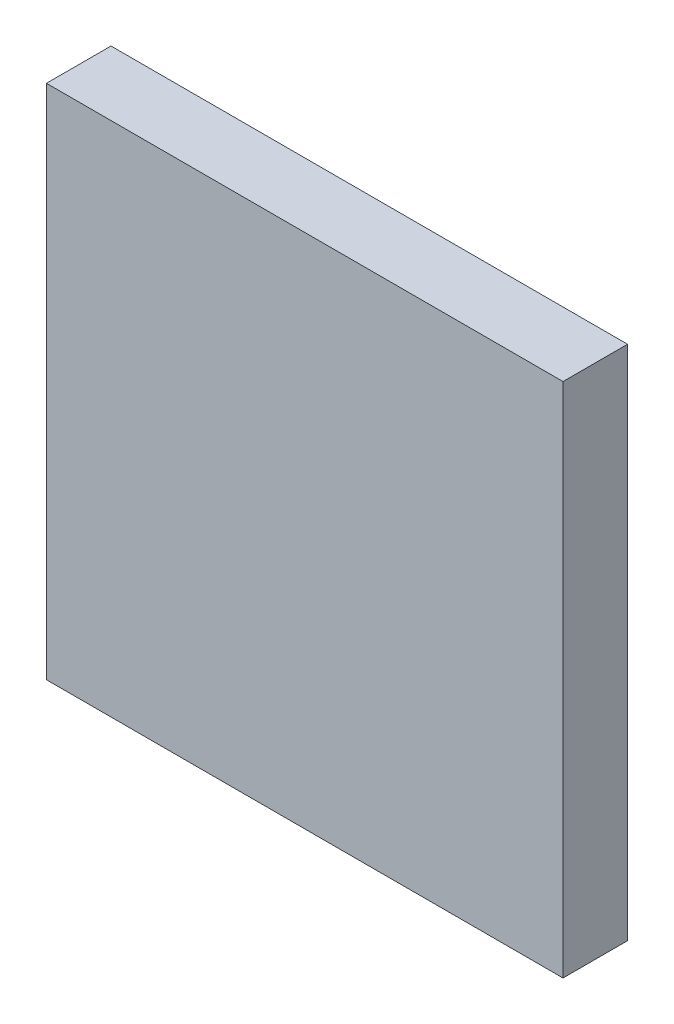
ISO-10303-21;
HEADER;
FILE_DESCRIPTION(('STEP AP214'),'2;1');
FILE_NAME('part.step','',(''),(''),'','','');
FILE_SCHEMA(('AUTOMOTIVE_DESIGN { 1 0 10303 214 1 1 1 1 }'));
ENDSEC;
DATA;
#1=APPLICATION_CONTEXT('core data for automotive mechanical design processes');
#2=APPLICATION_PROTOCOL_DEFINITION('international standard','automotive_design',2000,#1);
#3=PRODUCT_CONTEXT('',#1,'mechanical');
#4=PRODUCT('Part','Part','',(#3));
#5=PRODUCT_RELATED_PRODUCT_CATEGORY('part','',(#4));
#6=PRODUCT_DEFINITION_FORMATION('','',#4);
#7=PRODUCT_DEFINITION_CONTEXT('part definition',#1,'design');
#8=PRODUCT_DEFINITION('design','',#6,#7);
#9=PRODUCT_DEFINITION_SHAPE('','',#8);
#10=(LENGTH_UNIT() NAMED_UNIT(*) SI_UNIT(.MILLI.,.METRE.));
#11=(NAMED_UNIT(*) PLANE_ANGLE_UNIT() SI_UNIT($,.RADIAN.));
#12=(NAMED_UNIT(*) SI_UNIT($,.STERADIAN.) SOLID_ANGLE_UNIT());
#13=UNCERTAINTY_MEASURE_WITH_UNIT(LENGTH_MEASURE(1.E-05),#10,'distance_accuracy_value','');
#14=(GEOMETRIC_REPRESENTATION_CONTEXT(3) GLOBAL_UNCERTAINTY_ASSIGNED_CONTEXT((#13)) GLOBAL_UNIT_ASSIGNED_CONTEXT((#10,
#11,#12)) REPRESENTATION_CONTEXT('',''));
#15=CARTESIAN_POINT('',(0.,0.,0.));
#16=DIRECTION('',(0.,0.,1.));
#17=DIRECTION('',(1.,0.,0.));
#18=AXIS2_PLACEMENT_3D('',#15,#16,#17);
#19=CARTESIAN_POINT('',(0.,0.,3.175));
#20=DIRECTION('',(-1.,0.,0.));
#21=DIRECTION('',(0.,0.,1.));
#22=AXIS2_PLACEMENT_3D('',#19,#20,#21);
#23=PLANE('',#22);
#24=DIRECTION('',(0.,1.,0.));
#25=VECTOR('',#24,1.);
#26=CARTESIAN_POINT('',(0.,0.,0.));
#27=LINE('',#26,#25);
#28=CARTESIAN_POINT('',(0.,0.,0.));
#29=VERTEX_POINT('',#28);
#30=CARTESIAN_POINT('',(0.,25.4,0.));
#31=VERTEX_POINT('',#30);
#32=EDGE_CURVE('E107',#29,#31,#27,.T.);
#33=ORIENTED_EDGE('',*,*,#32,.T.);
#34=DIRECTION('',(0.,0.,-1.));
#35=VECTOR('',#34,1.);
#36=CARTESIAN_POINT('',(0.,25.4,3.175));
#37=LINE('',#36,#35);
#38=CARTESIAN_POINT('',(0.,25.4,3.175));
#39=VERTEX_POINT('',#38);
#40=EDGE_CURVE('E11',#39,#31,#37,.T.);
#41=ORIENTED_EDGE('',*,*,#40,.F.);
#42=DIRECTION('',(0.,1.,0.));
#43=VECTOR('',#42,1.);
#44=CARTESIAN_POINT('',(0.,0.,3.175));
#45=LINE('',#44,#43);
#46=CARTESIAN_POINT('',(0.,0.,3.175));
#47=VERTEX_POINT('',#46);
#48=EDGE_CURVE('E91',#47,#39,#45,.T.);
#49=ORIENTED_EDGE('',*,*,#48,.F.);
#50=DIRECTION('',(0.,0.,-1.));
#51=VECTOR('',#50,1.);
#52=CARTESIAN_POINT('',(0.,0.,3.175));
#53=LINE('',#52,#51);
#54=EDGE_CURVE('E103',#47,#29,#53,.T.);
#55=ORIENTED_EDGE('',*,*,#54,.T.);
#56=EDGE_LOOP('',(#33,#41,#49,#55));
#57=FACE_BOUND('',#56,.T.);
#58=ADVANCED_FACE('F39',(#57),#23,.F.);
#59=CARTESIAN_POINT('',(0.,25.4,3.175));
#60=DIRECTION('',(0.,-1.,0.));
#61=DIRECTION('',(0.,0.,-1.));
#62=AXIS2_PLACEMENT_3D('',#59,#60,#61);
#63=PLANE('',#62);
#64=DIRECTION('',(-1.,0.,0.));
#65=VECTOR('',#64,1.);
#66=CARTESIAN_POINT('',(0.,25.4,0.));
#67=LINE('',#66,#65);
#68=CARTESIAN_POINT('',(-25.4,25.4,0.));
#69=VERTEX_POINT('',#68);
#70=EDGE_CURVE('E96',#31,#69,#67,.T.);
#71=ORIENTED_EDGE('',*,*,#70,.T.);
#72=DIRECTION('',(0.,0.,-1.));
#73=VECTOR('',#72,1.);
#74=CARTESIAN_POINT('',(-25.4,25.4,3.175));
#75=LINE('',#74,#73);
#76=CARTESIAN_POINT('',(-25.4,25.4,3.175));
#77=VERTEX_POINT('',#76);
#78=EDGE_CURVE('E48',#77,#69,#75,.T.);
#79=ORIENTED_EDGE('',*,*,#78,.F.);
#80=DIRECTION('',(-1.,0.,0.));
#81=VECTOR('',#80,1.);
#82=CARTESIAN_POINT('',(0.,25.4,3.175));
#83=LINE('',#82,#81);
#84=EDGE_CURVE('E86',#39,#77,#83,.T.);
#85=ORIENTED_EDGE('',*,*,#84,.F.);
#86=ORIENTED_EDGE('',*,*,#40,.T.);
#87=EDGE_LOOP('',(#71,#79,#85,#86));
#88=FACE_BOUND('',#87,.T.);
#89=ADVANCED_FACE('F95',(#88),#63,.F.);
#90=CARTESIAN_POINT('',(-25.4,0.,3.175));
#91=DIRECTION('',(1.,0.,0.));
#92=DIRECTION('',(0.,0.,-1.));
#93=AXIS2_PLACEMENT_3D('',#90,#91,#92);
#94=PLANE('',#93);
#95=DIRECTION('',(0.,-1.,0.));
#96=VECTOR('',#95,1.);
#97=CARTESIAN_POINT('',(-25.4,0.,0.));
#98=LINE('',#97,#96);
#99=CARTESIAN_POINT('',(-25.4,0.,0.));
#100=VERTEX_POINT('',#99);
#101=EDGE_CURVE('E73',#69,#100,#98,.T.);
#102=ORIENTED_EDGE('',*,*,#101,.T.);
#103=DIRECTION('',(0.,0.,-1.));
#104=VECTOR('',#103,1.);
#105=CARTESIAN_POINT('',(-25.4,0.,3.175));
#106=LINE('',#105,#104);
#107=CARTESIAN_POINT('',(-25.4,0.,3.175));
#108=VERTEX_POINT('',#107);
#109=EDGE_CURVE('E98',#108,#100,#106,.T.);
#110=ORIENTED_EDGE('',*,*,#109,.F.);
#111=DIRECTION('',(0.,-1.,0.));
#112=VECTOR('',#111,1.);
#113=CARTESIAN_POINT('',(-25.4,0.,3.175));
#114=LINE('',#113,#112);
#115=EDGE_CURVE('E89',#77,#108,#114,.T.);
#116=ORIENTED_EDGE('',*,*,#115,.F.);
#117=ORIENTED_EDGE('',*,*,#78,.T.);
#118=EDGE_LOOP('',(#102,#110,#116,#117));
#119=FACE_BOUND('',#118,.T.);
#120=ADVANCED_FACE('F99',(#119),#94,.F.);
#121=CARTESIAN_POINT('',(0.,0.,3.175));
#122=DIRECTION('',(0.,1.,0.));
#123=DIRECTION('',(-1.,0.,0.));
#124=AXIS2_PLACEMENT_3D('',#121,#122,#123);
#125=PLANE('',#124);
#126=DIRECTION('',(1.,0.,0.));
#127=VECTOR('',#126,1.);
#128=CARTESIAN_POINT('',(0.,0.,0.));
#129=LINE('',#128,#127);
#130=EDGE_CURVE('E79',#100,#29,#129,.T.);
#131=ORIENTED_EDGE('',*,*,#130,.T.);
#132=ORIENTED_EDGE('',*,*,#54,.F.);
#133=DIRECTION('',(1.,0.,0.));
#134=VECTOR('',#133,1.);
#135=CARTESIAN_POINT('',(0.,0.,3.175));
#136=LINE('',#135,#134);
#137=EDGE_CURVE('E56',#108,#47,#136,.T.);
#138=ORIENTED_EDGE('',*,*,#137,.F.);
#139=ORIENTED_EDGE('',*,*,#109,.T.);
#140=EDGE_LOOP('',(#131,#132,#138,#139));
#141=FACE_BOUND('',#140,.T.);
#142=ADVANCED_FACE('F120',(#141),#125,.F.);
#143=CARTESIAN_POINT('',(0.,0.,3.175));
#144=DIRECTION('',(0.,0.,1.));
#145=DIRECTION('',(1.,0.,0.));
#146=AXIS2_PLACEMENT_3D('',#143,#144,#145);
#147=PLANE('',#146);
#148=ORIENTED_EDGE('',*,*,#48,.T.);
#149=ORIENTED_EDGE('',*,*,#84,.T.);
#150=ORIENTED_EDGE('',*,*,#115,.T.);
#151=ORIENTED_EDGE('',*,*,#137,.T.);
#152=EDGE_LOOP('',(#148,#149,#150,#151));
#153=FACE_BOUND('',#152,.T.);
#154=ADVANCED_FACE('F87',(#153),#147,.T.);
#155=CARTESIAN_POINT('',(0.,0.,0.));
#156=DIRECTION('',(0.,0.,1.));
#157=DIRECTION('',(1.,0.,0.));
#158=AXIS2_PLACEMENT_3D('',#155,#156,#157);
#159=PLANE('',#158);
#160=ORIENTED_EDGE('',*,*,#32,.F.);
#161=ORIENTED_EDGE('',*,*,#130,.F.);
#162=ORIENTED_EDGE('',*,*,#101,.F.);
#163=ORIENTED_EDGE('',*,*,#70,.F.);
#164=EDGE_LOOP('',(#160,#161,#162,#163));
#165=FACE_BOUND('',#164,.T.);
#166=ADVANCED_FACE('F123',(#165),#159,.F.);
#167=CLOSED_SHELL('',(#58,#89,#120,#142,#154,#166));
#168=MANIFOLD_SOLID_BREP('B2',#167);
#169=ADVANCED_BREP_SHAPE_REPRESENTATION('',(#18,#168),#14);
#170=SHAPE_DEFINITION_REPRESENTATION(#9,#169);
ENDSEC;
END-ISO-10303-21;
